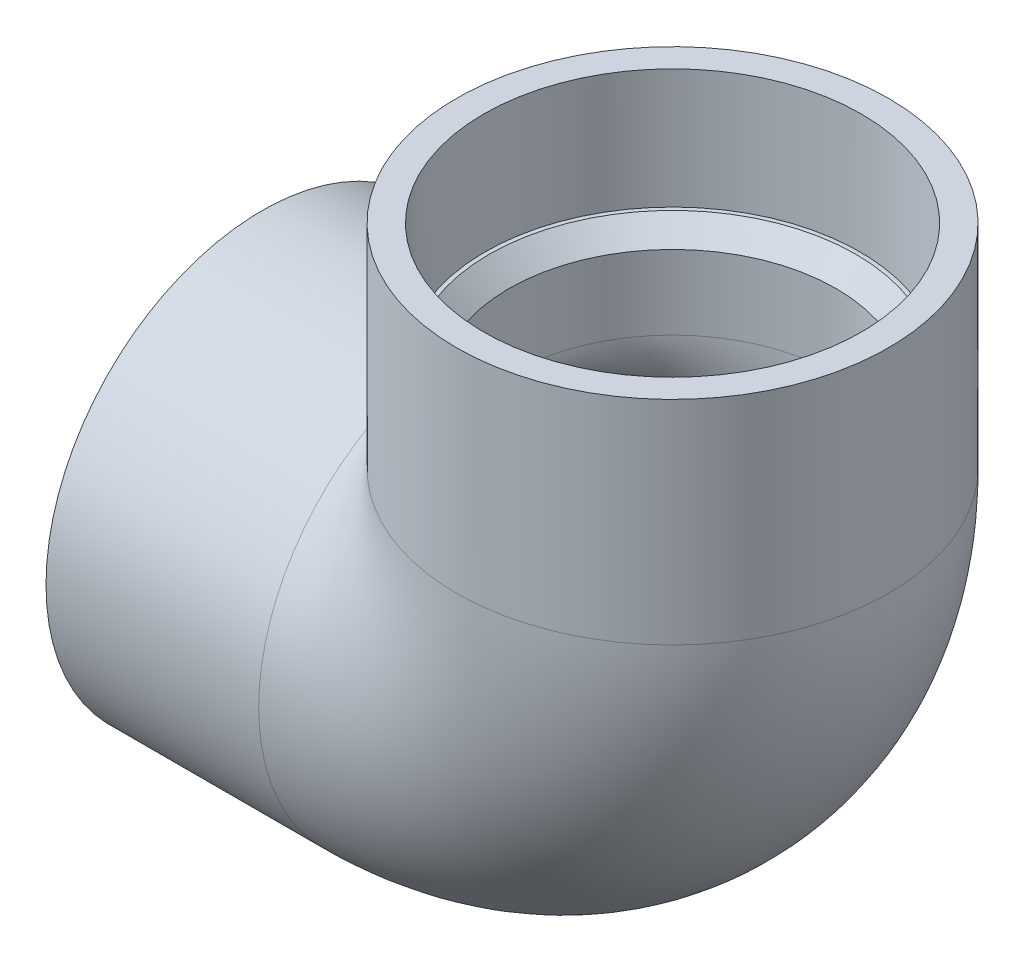
ISO-10303-21;
HEADER;
FILE_DESCRIPTION(('STEP AP214'),'2;1');
FILE_NAME('part.step','',(''),(''),'','','');
FILE_SCHEMA(('AUTOMOTIVE_DESIGN { 1 0 10303 214 1 1 1 1 }'));
ENDSEC;
DATA;
#1=APPLICATION_CONTEXT('core data for automotive mechanical design processes');
#2=APPLICATION_PROTOCOL_DEFINITION('international standard','automotive_design',2000,#1);
#3=PRODUCT_CONTEXT('',#1,'mechanical');
#4=PRODUCT('Part','Part','',(#3));
#5=PRODUCT_RELATED_PRODUCT_CATEGORY('part','',(#4));
#6=PRODUCT_DEFINITION_FORMATION('','',#4);
#7=PRODUCT_DEFINITION_CONTEXT('part definition',#1,'design');
#8=PRODUCT_DEFINITION('design','',#6,#7);
#9=PRODUCT_DEFINITION_SHAPE('','',#8);
#10=(LENGTH_UNIT() NAMED_UNIT(*) SI_UNIT(.MILLI.,.METRE.));
#11=(NAMED_UNIT(*) PLANE_ANGLE_UNIT() SI_UNIT($,.RADIAN.));
#12=(NAMED_UNIT(*) SI_UNIT($,.STERADIAN.) SOLID_ANGLE_UNIT());
#13=UNCERTAINTY_MEASURE_WITH_UNIT(LENGTH_MEASURE(1.E-05),#10,'distance_accuracy_value','');
#14=(GEOMETRIC_REPRESENTATION_CONTEXT(3) GLOBAL_UNCERTAINTY_ASSIGNED_CONTEXT((#13)) GLOBAL_UNIT_ASSIGNED_CONTEXT((#10,
#11,#12)) REPRESENTATION_CONTEXT('',''));
#15=CARTESIAN_POINT('',(0.,0.,0.));
#16=DIRECTION('',(0.,0.,1.));
#17=DIRECTION('',(1.,0.,0.));
#18=AXIS2_PLACEMENT_3D('',#15,#16,#17);
#19=CARTESIAN_POINT('',(-65.88125,-34.671,0.));
#20=DIRECTION('',(-1.,0.,0.));
#21=DIRECTION('',(0.,0.,1.));
#22=AXIS2_PLACEMENT_3D('',#19,#20,#21);
#23=PLANE('',#22);
#24=CARTESIAN_POINT('',(-65.88125,0.,0.));
#25=DIRECTION('',(-1.,0.,0.));
#26=DIRECTION('',(0.,0.,1.));
#27=AXIS2_PLACEMENT_3D('',#24,#25,#26);
#28=CIRCLE('',#27,34.671);
#29=CARTESIAN_POINT('',(-65.88125,0.,34.671));
#30=VERTEX_POINT('',#29);
#31=EDGE_CURVE('E58',#30,#30,#28,.T.);
#32=ORIENTED_EDGE('',*,*,#31,.T.);
#33=EDGE_LOOP('',(#32));
#34=FACE_BOUND('',#33,.T.);
#35=CARTESIAN_POINT('',(-65.88125,0.,0.));
#36=DIRECTION('',(-1.,0.,0.));
#37=DIRECTION('',(0.,0.,1.));
#38=AXIS2_PLACEMENT_3D('',#35,#36,#37);
#39=CIRCLE('',#38,30.3149);
#40=CARTESIAN_POINT('',(-65.88125,0.,30.3149));
#41=VERTEX_POINT('',#40);
#42=EDGE_CURVE('E72',#41,#41,#39,.T.);
#43=ORIENTED_EDGE('',*,*,#42,.F.);
#44=EDGE_LOOP('',(#43));
#45=FACE_BOUND('',#44,.T.);
#46=ADVANCED_FACE('F36',(#34,#45),#23,.T.);
#47=CARTESIAN_POINT('',(-31.75,0.,0.));
#48=DIRECTION('',(-1.,0.,0.));
#49=DIRECTION('',(0.,0.,1.));
#50=AXIS2_PLACEMENT_3D('',#47,#48,#49);
#51=CONICAL_SURFACE('',#50,30.0863,0.00669757427132578);
#52=ORIENTED_EDGE('',*,*,#42,.T.);
#53=EDGE_LOOP('',(#52));
#54=FACE_BOUND('',#53,.T.);
#55=CARTESIAN_POINT('',(-31.75,0.,0.));
#56=DIRECTION('',(-1.,0.,0.));
#57=DIRECTION('',(0.,0.,1.));
#58=AXIS2_PLACEMENT_3D('',#55,#56,#57);
#59=CIRCLE('',#58,30.0863);
#60=CARTESIAN_POINT('',(-31.75,0.,30.0863));
#61=VERTEX_POINT('',#60);
#62=EDGE_CURVE('E69',#61,#61,#59,.T.);
#63=ORIENTED_EDGE('',*,*,#62,.F.);
#64=EDGE_LOOP('',(#63));
#65=FACE_BOUND('',#64,.T.);
#66=ADVANCED_FACE('F107',(#54,#65),#51,.F.);
#67=CARTESIAN_POINT('',(-65.88125,0.,0.));
#68=DIRECTION('',(-1.,0.,0.));
#69=DIRECTION('',(0.,0.,1.));
#70=AXIS2_PLACEMENT_3D('',#67,#68,#69);
#71=CYLINDRICAL_SURFACE('',#70,34.671);
#72=CARTESIAN_POINT('',(0.,0.,0.));
#73=DIRECTION('',(-0.707106781186547,-0.707106781186547,0.));
#74=DIRECTION('',(-0.707106781186547,0.707106781186547,0.));
#75=AXIS2_PLACEMENT_3D('',#72,#73,#74);
#76=ELLIPSE('',#75,49.0321984210376,34.671);
#77=CARTESIAN_POINT('',(-31.75,31.75,-13.928953334691));
#78=VERTEX_POINT('',#77);
#79=CARTESIAN_POINT('',(-31.75,31.75,13.928953334691));
#80=VERTEX_POINT('',#79);
#81=EDGE_CURVE('E57',#78,#80,#76,.F.);
#82=ORIENTED_EDGE('',*,*,#81,.F.);
#83=CARTESIAN_POINT('',(-31.75,0.,0.));
#84=DIRECTION('',(-1.,0.,0.));
#85=DIRECTION('',(0.,0.,1.));
#86=AXIS2_PLACEMENT_3D('',#83,#84,#85);
#87=CIRCLE('',#86,34.671);
#88=EDGE_CURVE('E64',#78,#80,#87,.T.);
#89=ORIENTED_EDGE('',*,*,#88,.T.);
#90=EDGE_LOOP('',(#82,#89));
#91=FACE_BOUND('',#90,.T.);
#92=ORIENTED_EDGE('',*,*,#31,.F.);
#93=EDGE_LOOP('',(#92));
#94=FACE_BOUND('',#93,.T.);
#95=ADVANCED_FACE('F62',(#91,#94),#71,.T.);
#96=CARTESIAN_POINT('',(-31.75,31.75,0.));
#97=DIRECTION('',(0.,0.,-1.));
#98=DIRECTION('',(-1.,0.,0.));
#99=AXIS2_PLACEMENT_3D('',#96,#97,#98);
#100=TOROIDAL_SURFACE('',#99,31.75,26.2509);
#101=CARTESIAN_POINT('',(0.,31.75,0.));
#102=DIRECTION('',(0.,1.,0.));
#103=DIRECTION('',(0.,0.,-1.));
#104=AXIS2_PLACEMENT_3D('',#101,#102,#103);
#105=CIRCLE('',#104,26.2509);
#106=CARTESIAN_POINT('',(26.2509,31.75,0.));
#107=VERTEX_POINT('',#106);
#108=EDGE_CURVE('E59',#107,#107,#105,.T.);
#109=CARTESIAN_POINT('',(-31.75,0.,0.));
#110=DIRECTION('',(1.,0.,0.));
#111=DIRECTION('',(0.,0.,-1.));
#112=AXIS2_PLACEMENT_3D('',#109,#110,#111);
#113=CIRCLE('',#112,26.2509);
#114=CARTESIAN_POINT('',(-31.75,-26.2509,0.));
#115=VERTEX_POINT('',#114);
#116=EDGE_CURVE('E65',#115,#115,#113,.T.);
#117=CARTESIAN_POINT('',(-31.75,31.75,0.));
#118=DIRECTION('',(0.,0.,-1.));
#119=DIRECTION('',(-1.,0.,0.));
#120=AXIS2_PLACEMENT_3D('',#117,#118,#119);
#121=CIRCLE('',#120,58.0009);
#122=EDGE_CURVE('',#107,#115,#121,.T.);
#123=ORIENTED_EDGE('',*,*,#108,.T.);
#124=ORIENTED_EDGE('',*,*,#116,.F.);
#125=ORIENTED_EDGE('',*,*,#122,.T.);
#126=ORIENTED_EDGE('',*,*,#122,.F.);
#127=EDGE_LOOP('',(#123,#125,#124,#126));
#128=FACE_BOUND('',#127,.T.);
#129=ADVANCED_FACE('F119',(#128),#100,.F.);
#130=CARTESIAN_POINT('',(-63.5,31.75,0.));
#131=DIRECTION('',(0.,-1.,0.));
#132=DIRECTION('',(-1.,0.,0.));
#133=AXIS2_PLACEMENT_3D('',#130,#131,#132);
#134=CIRCLE('',#133,34.671);
#135=TRIMMED_CURVE('',#134,(PARAMETER_VALUE(-2.72816941192996)),
(PARAMETER_VALUE(2.72816941192996)),.T.,.PARAMETER.);
#136=CARTESIAN_POINT('',(-31.75,31.75,0.));
#137=DIRECTION('',(0.,0.,-1.));
#138=AXIS1_PLACEMENT('',#136,#137);
#139=SURFACE_OF_REVOLUTION('',#135,#138);
#140=CARTESIAN_POINT('',(0.,31.75,0.));
#141=DIRECTION('',(0.,1.,0.));
#142=DIRECTION('',(0.,0.,-1.));
#143=AXIS2_PLACEMENT_3D('',#140,#141,#142);
#144=CIRCLE('',#143,34.671);
#145=EDGE_CURVE('E51',#80,#78,#144,.T.);
#146=ORIENTED_EDGE('',*,*,#145,.F.);
#147=ORIENTED_EDGE('',*,*,#88,.F.);
#148=EDGE_LOOP('',(#146,#147));
#149=FACE_BOUND('',#148,.T.);
#150=ADVANCED_FACE('F68',(#149),#139,.T.);
#151=CARTESIAN_POINT('',(34.671,65.88125,0.));
#152=DIRECTION('',(0.,1.,0.));
#153=DIRECTION('',(0.,0.,1.));
#154=AXIS2_PLACEMENT_3D('',#151,#152,#153);
#155=PLANE('',#154);
#156=CARTESIAN_POINT('',(0.,65.88125,0.));
#157=DIRECTION('',(0.,-1.,0.));
#158=DIRECTION('',(0.,0.,-1.));
#159=AXIS2_PLACEMENT_3D('',#156,#157,#158);
#160=CIRCLE('',#159,30.3149);
#161=CARTESIAN_POINT('',(0.,65.88125,-30.3149));
#162=VERTEX_POINT('',#161);
#163=EDGE_CURVE('E170',#162,#162,#160,.T.);
#164=ORIENTED_EDGE('',*,*,#163,.T.);
#165=EDGE_LOOP('',(#164));
#166=FACE_BOUND('',#165,.T.);
#167=CARTESIAN_POINT('',(0.,65.88125,0.));
#168=DIRECTION('',(0.,-1.,0.));
#169=DIRECTION('',(0.,0.,-1.));
#170=AXIS2_PLACEMENT_3D('',#167,#168,#169);
#171=CIRCLE('',#170,34.671);
#172=CARTESIAN_POINT('',(0.,65.88125,-34.671));
#173=VERTEX_POINT('',#172);
#174=EDGE_CURVE('E66',#173,#173,#171,.T.);
#175=ORIENTED_EDGE('',*,*,#174,.F.);
#176=EDGE_LOOP('',(#175));
#177=FACE_BOUND('',#176,.T.);
#178=ADVANCED_FACE('F122',(#166,#177),#155,.T.);
#179=CARTESIAN_POINT('',(0.,0.,0.));
#180=DIRECTION('',(0.,-1.,0.));
#181=DIRECTION('',(0.,0.,-1.));
#182=AXIS2_PLACEMENT_3D('',#179,#180,#181);
#183=CYLINDRICAL_SURFACE('',#182,34.671);
#184=ORIENTED_EDGE('',*,*,#174,.T.);
#185=EDGE_LOOP('',(#184));
#186=FACE_BOUND('',#185,.T.);
#187=ORIENTED_EDGE('',*,*,#145,.T.);
#188=ORIENTED_EDGE('',*,*,#81,.T.);
#189=EDGE_LOOP('',(#187,#188));
#190=FACE_BOUND('',#189,.T.);
#191=ADVANCED_FACE('F56',(#186,#190),#183,.T.);
#192=CARTESIAN_POINT('',(0.,65.88125,0.));
#193=DIRECTION('',(0.,1.,0.));
#194=DIRECTION('',(0.,0.,1.));
#195=AXIS2_PLACEMENT_3D('',#192,#193,#194);
#196=CONICAL_SURFACE('',#195,30.3149,0.00669757427132578);
#197=CARTESIAN_POINT('',(0.,31.75,0.));
#198=DIRECTION('',(0.,1.,0.));
#199=DIRECTION('',(-1.,0.,0.));
#200=AXIS2_PLACEMENT_3D('',#197,#198,#199);
#201=CIRCLE('',#200,30.0863);
#202=CARTESIAN_POINT('',(-30.0863,31.75,0.));
#203=VERTEX_POINT('',#202);
#204=EDGE_CURVE('E165',#203,#203,#201,.T.);
#205=ORIENTED_EDGE('',*,*,#204,.F.);
#206=EDGE_LOOP('',(#205));
#207=FACE_BOUND('',#206,.T.);
#208=ORIENTED_EDGE('',*,*,#163,.F.);
#209=EDGE_LOOP('',(#208));
#210=FACE_BOUND('',#209,.T.);
#211=ADVANCED_FACE('F131',(#207,#210),#196,.F.);
#212=CARTESIAN_POINT('',(-150.978157003251,0.,0.));
#213=DIRECTION('',(1.,0.,0.));
#214=DIRECTION('',(0.,0.,-1.));
#215=AXIS2_PLACEMENT_3D('',#212,#213,#214);
#216=CYLINDRICAL_SURFACE('',#215,30.0863);
#217=ORIENTED_EDGE('',*,*,#62,.T.);
#218=EDGE_LOOP('',(#217));
#219=FACE_BOUND('',#218,.T.);
#220=CARTESIAN_POINT('',(-46.83125,0.,0.));
#221=DIRECTION('',(-1.,0.,0.));
#222=DIRECTION('',(0.,0.,1.));
#223=AXIS2_PLACEMENT_3D('',#220,#221,#222);
#224=CIRCLE('',#223,30.0863);
#225=CARTESIAN_POINT('',(-46.83125,0.,30.0863));
#226=VERTEX_POINT('',#225);
#227=EDGE_CURVE('E164',#226,#226,#224,.T.);
#228=ORIENTED_EDGE('',*,*,#227,.F.);
#229=EDGE_LOOP('',(#228));
#230=FACE_BOUND('',#229,.T.);
#231=ADVANCED_FACE('F135',(#219,#230),#216,.T.);
#232=CARTESIAN_POINT('',(-150.978157003251,0.,0.));
#233=DIRECTION('',(1.,0.,0.));
#234=DIRECTION('',(0.,0.,-1.));
#235=AXIS2_PLACEMENT_3D('',#232,#233,#234);
#236=CYLINDRICAL_SURFACE('',#235,26.2509);
#237=CARTESIAN_POINT('',(-43.65625,0.,0.));
#238=DIRECTION('',(-1.,0.,0.));
#239=DIRECTION('',(0.,0.,1.));
#240=AXIS2_PLACEMENT_3D('',#237,#238,#239);
#241=CIRCLE('',#240,26.2509);
#242=CARTESIAN_POINT('',(-43.65625,0.,26.2509));
#243=VERTEX_POINT('',#242);
#244=EDGE_CURVE('E81',#243,#243,#241,.T.);
#245=ORIENTED_EDGE('',*,*,#244,.T.);
#246=EDGE_LOOP('',(#245));
#247=FACE_BOUND('',#246,.T.);
#248=ORIENTED_EDGE('',*,*,#116,.T.);
#249=EDGE_LOOP('',(#248));
#250=FACE_BOUND('',#249,.T.);
#251=ADVANCED_FACE('F139',(#247,#250),#236,.F.);
#252=CARTESIAN_POINT('',(-46.83125,-34.671,0.));
#253=DIRECTION('',(-1.,0.,0.));
#254=DIRECTION('',(0.,0.,1.));
#255=AXIS2_PLACEMENT_3D('',#252,#253,#254);
#256=PLANE('',#255);
#257=CARTESIAN_POINT('',(-46.83125,0.,0.));
#258=DIRECTION('',(-1.,0.,0.));
#259=DIRECTION('',(0.,0.,1.));
#260=AXIS2_PLACEMENT_3D('',#257,#258,#259);
#261=CIRCLE('',#260,29.4259);
#262=CARTESIAN_POINT('',(-46.83125,0.,29.4259));
#263=VERTEX_POINT('',#262);
#264=EDGE_CURVE('E85',#263,#263,#261,.F.);
#265=ORIENTED_EDGE('',*,*,#264,.T.);
#266=EDGE_LOOP('',(#265));
#267=FACE_BOUND('',#266,.T.);
#268=ORIENTED_EDGE('',*,*,#227,.T.);
#269=EDGE_LOOP('',(#268));
#270=FACE_BOUND('',#269,.T.);
#271=ADVANCED_FACE('F143',(#267,#270),#256,.T.);
#272=CARTESIAN_POINT('',(0.,150.978157003251,0.));
#273=DIRECTION('',(0.,-1.,0.));
#274=DIRECTION('',(1.,0.,0.));
#275=AXIS2_PLACEMENT_3D('',#272,#273,#274);
#276=CYLINDRICAL_SURFACE('',#275,30.0863);
#277=ORIENTED_EDGE('',*,*,#204,.T.);
#278=EDGE_LOOP('',(#277));
#279=FACE_BOUND('',#278,.T.);
#280=CARTESIAN_POINT('',(0.,46.83125,0.));
#281=DIRECTION('',(0.,1.,0.));
#282=DIRECTION('',(0.,0.,1.));
#283=AXIS2_PLACEMENT_3D('',#280,#281,#282);
#284=CIRCLE('',#283,30.0863);
#285=CARTESIAN_POINT('',(0.,46.83125,30.0863));
#286=VERTEX_POINT('',#285);
#287=EDGE_CURVE('E161',#286,#286,#284,.T.);
#288=ORIENTED_EDGE('',*,*,#287,.F.);
#289=EDGE_LOOP('',(#288));
#290=FACE_BOUND('',#289,.T.);
#291=ADVANCED_FACE('F147',(#279,#290),#276,.T.);
#292=CARTESIAN_POINT('',(0.,150.978157003251,0.));
#293=DIRECTION('',(0.,-1.,0.));
#294=DIRECTION('',(1.,0.,0.));
#295=AXIS2_PLACEMENT_3D('',#292,#293,#294);
#296=CYLINDRICAL_SURFACE('',#295,26.2509);
#297=CARTESIAN_POINT('',(0.,43.65625,0.));
#298=DIRECTION('',(0.,1.,0.));
#299=DIRECTION('',(-1.,0.,0.));
#300=AXIS2_PLACEMENT_3D('',#297,#298,#299);
#301=CIRCLE('',#300,26.2509);
#302=CARTESIAN_POINT('',(-26.2509,43.65625,0.));
#303=VERTEX_POINT('',#302);
#304=EDGE_CURVE('E45',#303,#303,#301,.T.);
#305=ORIENTED_EDGE('',*,*,#304,.T.);
#306=EDGE_LOOP('',(#305));
#307=FACE_BOUND('',#306,.T.);
#308=ORIENTED_EDGE('',*,*,#108,.F.);
#309=EDGE_LOOP('',(#308));
#310=FACE_BOUND('',#309,.T.);
#311=ADVANCED_FACE('F94',(#307,#310),#296,.F.);
#312=CARTESIAN_POINT('',(34.671,46.83125,0.));
#313=DIRECTION('',(0.,1.,0.));
#314=DIRECTION('',(0.,0.,1.));
#315=AXIS2_PLACEMENT_3D('',#312,#313,#314);
#316=PLANE('',#315);
#317=CARTESIAN_POINT('',(0.,46.83125,0.));
#318=DIRECTION('',(0.,1.,0.));
#319=DIRECTION('',(0.,0.,1.));
#320=AXIS2_PLACEMENT_3D('',#317,#318,#319);
#321=CIRCLE('',#320,29.4259);
#322=CARTESIAN_POINT('',(0.,46.83125,29.4259));
#323=VERTEX_POINT('',#322);
#324=EDGE_CURVE('E12',#323,#323,#321,.F.);
#325=ORIENTED_EDGE('',*,*,#324,.T.);
#326=EDGE_LOOP('',(#325));
#327=FACE_BOUND('',#326,.T.);
#328=ORIENTED_EDGE('',*,*,#287,.T.);
#329=EDGE_LOOP('',(#328));
#330=FACE_BOUND('',#329,.T.);
#331=ADVANCED_FACE('F103',(#327,#330),#316,.T.);
#332=CARTESIAN_POINT('',(-43.65625,0.,0.));
#333=DIRECTION('',(-1.,0.,0.));
#334=DIRECTION('',(0.,0.,1.));
#335=AXIS2_PLACEMENT_3D('',#332,#333,#334);
#336=CONICAL_SURFACE('',#335,26.2509,0.78539816339745);
#337=CARTESIAN_POINT('',(-46.83125,0.,29.4259));
#338=CARTESIAN_POINT('',(-46.7981770833333,0.,29.3928270833334));
#339=CARTESIAN_POINT('',(-46.7651041666667,0.,29.3597541666667));
#340=CARTESIAN_POINT('',(-46.6989583333333,0.,29.2936083333333));
#341=CARTESIAN_POINT('',(-46.6658854166667,0.,29.2605354166667));
#342=CARTESIAN_POINT('',(-46.5997395833333,0.,29.1943895833333));
#343=CARTESIAN_POINT('',(-46.5666666666666,0.,29.1613166666667));
#344=CARTESIAN_POINT('',(-46.5005208333333,0.,29.0951708333333));
#345=CARTESIAN_POINT('',(-46.4674479166667,0.,29.0620979166667));
#346=CARTESIAN_POINT('',(-46.4013020833333,0.,28.9959520833333));
#347=CARTESIAN_POINT('',(-46.3682291666667,0.,28.9628791666667));
#348=CARTESIAN_POINT('',(-46.3020833333333,0.,28.8967333333333));
#349=CARTESIAN_POINT('',(-46.2690104166667,0.,28.8636604166667));
#350=CARTESIAN_POINT('',(-46.2028645833333,0.,28.7975145833333));
#351=CARTESIAN_POINT('',(-46.1697916666667,0.,28.7644416666667));
#352=CARTESIAN_POINT('',(-46.1036458333333,0.,28.6982958333333));
#353=CARTESIAN_POINT('',(-46.0705729166666,0.,28.6652229166667));
#354=CARTESIAN_POINT('',(-46.0044270833333,0.,28.5990770833333));
#355=CARTESIAN_POINT('',(-45.9713541666667,0.,28.5660041666667));
#356=CARTESIAN_POINT('',(-45.9052083333333,0.,28.4998583333333));
#357=CARTESIAN_POINT('',(-45.8721354166667,0.,28.4667854166667));
#358=CARTESIAN_POINT('',(-45.8059895833333,0.,28.4006395833333));
#359=CARTESIAN_POINT('',(-45.7729166666666,0.,28.3675666666667));
#360=CARTESIAN_POINT('',(-45.7067708333333,0.,28.3014208333333));
#361=CARTESIAN_POINT('',(-45.6736979166667,0.,28.2683479166667));
#362=CARTESIAN_POINT('',(-45.6075520833333,0.,28.2022020833333));
#363=CARTESIAN_POINT('',(-45.5744791666667,0.,28.1691291666667));
#364=CARTESIAN_POINT('',(-45.5083333333333,0.,28.1029833333333));
#365=CARTESIAN_POINT('',(-45.4752604166667,0.,28.0699104166667));
#366=CARTESIAN_POINT('',(-45.4091145833333,0.,28.0037645833333));
#367=CARTESIAN_POINT('',(-45.3760416666667,0.,27.9706916666667));
#368=CARTESIAN_POINT('',(-45.3098958333333,0.,27.9045458333333));
#369=CARTESIAN_POINT('',(-45.2768229166666,0.,27.8714729166667));
#370=CARTESIAN_POINT('',(-45.2106770833333,0.,27.8053270833333));
#371=CARTESIAN_POINT('',(-45.1776041666666,0.,27.7722541666667));
#372=CARTESIAN_POINT('',(-45.1114583333333,0.,27.7061083333333));
#373=CARTESIAN_POINT('',(-45.0783854166666,0.,27.6730354166667));
#374=CARTESIAN_POINT('',(-45.0122395833333,0.,27.6068895833333));
#375=CARTESIAN_POINT('',(-44.9791666666666,0.,27.5738166666667));
#376=CARTESIAN_POINT('',(-44.9130208333333,0.,27.5076708333333));
#377=CARTESIAN_POINT('',(-44.8799479166667,0.,27.4745979166667));
#378=CARTESIAN_POINT('',(-44.8138020833333,0.,27.4084520833333));
#379=CARTESIAN_POINT('',(-44.7807291666667,0.,27.3753791666667));
#380=CARTESIAN_POINT('',(-44.7145833333333,0.,27.3092333333333));
#381=CARTESIAN_POINT('',(-44.6815104166666,0.,27.2761604166667));
#382=CARTESIAN_POINT('',(-44.6153645833333,0.,27.2100145833333));
#383=CARTESIAN_POINT('',(-44.5822916666666,0.,27.1769416666667));
#384=CARTESIAN_POINT('',(-44.5161458333333,0.,27.1107958333333));
#385=CARTESIAN_POINT('',(-44.4830729166666,0.,27.0777229166667));
#386=CARTESIAN_POINT('',(-44.4169270833333,0.,27.0115770833333));
#387=CARTESIAN_POINT('',(-44.3838541666666,0.,26.9785041666667));
#388=CARTESIAN_POINT('',(-44.3177083333333,0.,26.9123583333333));
#389=CARTESIAN_POINT('',(-44.2846354166666,0.,26.8792854166667));
#390=CARTESIAN_POINT('',(-44.2184895833333,0.,26.8131395833333));
#391=CARTESIAN_POINT('',(-44.1854166666666,0.,26.7800666666667));
#392=CARTESIAN_POINT('',(-44.1192708333333,0.,26.7139208333333));
#393=CARTESIAN_POINT('',(-44.0861979166666,0.,26.6808479166667));
#394=CARTESIAN_POINT('',(-44.0200520833333,0.,26.6147020833333));
#395=CARTESIAN_POINT('',(-43.9869791666667,0.,26.5816291666667));
#396=CARTESIAN_POINT('',(-43.9208333333333,0.,26.5154833333333));
#397=CARTESIAN_POINT('',(-43.8877604166666,0.,26.4824104166667));
#398=CARTESIAN_POINT('',(-43.8216145833333,0.,26.4162645833333));
#399=CARTESIAN_POINT('',(-43.7885416666666,0.,26.3831916666667));
#400=CARTESIAN_POINT('',(-43.7223958333333,0.,26.3170458333333));
#401=CARTESIAN_POINT('',(-43.6893229166666,0.,26.2839729166667));
#402=CARTESIAN_POINT('',(-43.65625,0.,26.2509));
#403=B_SPLINE_CURVE_WITH_KNOTS('',3,(#337,#338,#339,#340,#341,#342,#343,#344,#345,#346,#347,
#348,#349,#350,#351,#352,#353,#354,#355,#356,#357,#358,#359,#360,#361,#362,#363,#364,#365,#366,
#367,#368,#369,#370,#371,#372,#373,#374,#375,#376,#377,#378,#379,#380,#381,#382,#383,#384,#385,
#386,#387,#388,#389,#390,#391,#392,#393,#394,#395,#396,#397,#398,#399,#400,#401,#402),
.UNSPECIFIED.,.F.,.F.,(4,2,2,2,2,2,2,2,2,2,2,2,2,2,2,2,2,2,2,2,2,2,2,2,2,2,2,2,2,2,2,2,4),(0.,
0.140316501891705,0.28063300378341,0.420949505675119,0.561266007566824,0.701582509458526,
0.841899011350236,0.982215513241941,1.12253201513365,1.26284851702536,1.40316501891706,
1.54348152080877,1.68379802270047,1.82411452459218,1.96443102648389,2.10474752837559,
2.2450640302673,2.38538053215901,2.52569703405071,2.66601353594242,2.80633003783413,
2.94664653972583,3.08696304161754,3.22727954350924,3.36759604540095,3.50791254729266,
3.64822904918436,3.78854555107607,3.92886205296778,4.06917855485948,4.20949505675119,
4.34981155864289,4.4901280605346),.UNSPECIFIED.);
#404=EDGE_CURVE('BSEAM98',#263,#243,#403,.T.);
#405=ORIENTED_EDGE('',*,*,#264,.F.);
#406=ORIENTED_EDGE('',*,*,#244,.F.);
#407=ORIENTED_EDGE('',*,*,#404,.T.);
#408=ORIENTED_EDGE('',*,*,#404,.F.);
#409=EDGE_LOOP('',(#405,#407,#406,#408));
#410=FACE_BOUND('',#409,.T.);
#411=ADVANCED_FACE('F98',(#410),#336,.F.);
#412=CARTESIAN_POINT('',(0.,43.65625,0.));
#413=DIRECTION('',(0.,1.,0.));
#414=DIRECTION('',(-1.,0.,0.));
#415=AXIS2_PLACEMENT_3D('',#412,#413,#414);
#416=CONICAL_SURFACE('',#415,26.2509,0.785398163397451);
#417=ORIENTED_EDGE('',*,*,#324,.F.);
#418=EDGE_LOOP('',(#417));
#419=FACE_BOUND('',#418,.T.);
#420=ORIENTED_EDGE('',*,*,#304,.F.);
#421=EDGE_LOOP('',(#420));
#422=FACE_BOUND('',#421,.T.);
#423=ADVANCED_FACE('F38',(#419,#422),#416,.F.);
#424=CLOSED_SHELL('',(#46,#66,#95,#129,#150,#178,#191,#211,#231,#251,#271,#291,#311,#331,#411,#423));
#425=MANIFOLD_SOLID_BREP('B2',#424);
#426=ADVANCED_BREP_SHAPE_REPRESENTATION('',(#18,#425),#14);
#427=SHAPE_DEFINITION_REPRESENTATION(#9,#426);
ENDSEC;
END-ISO-10303-21;
